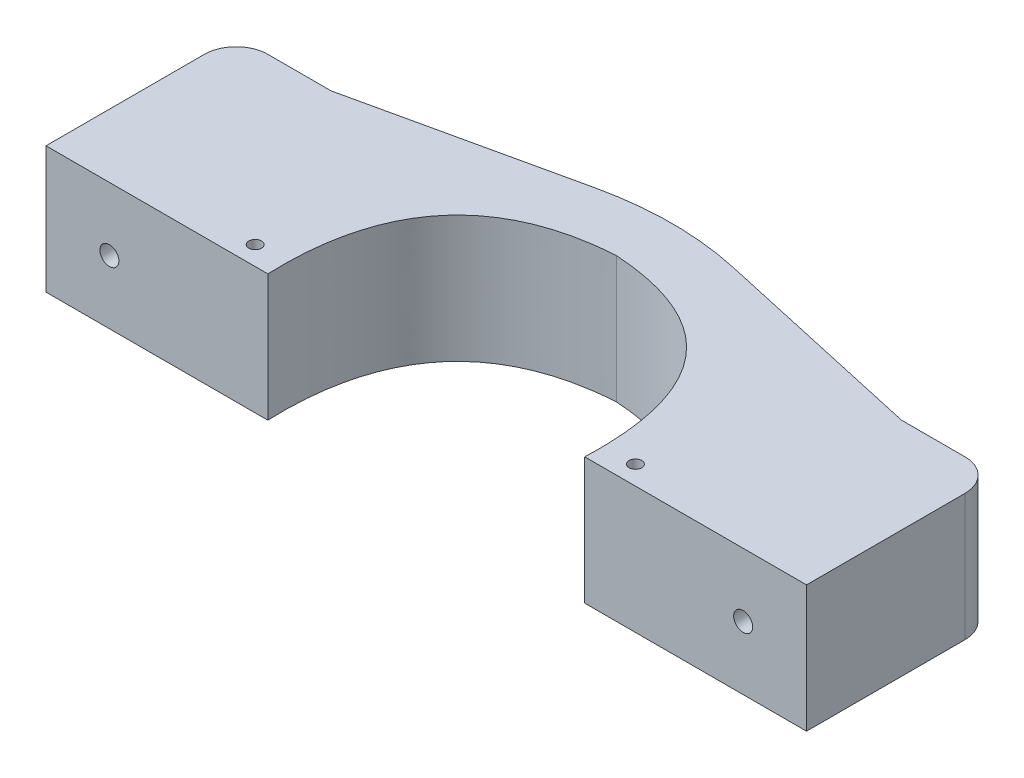
ISO-10303-21;
HEADER;
FILE_DESCRIPTION(('STEP AP214'),'2;1');
FILE_NAME('part.step','',(''),(''),'','','');
FILE_SCHEMA(('AUTOMOTIVE_DESIGN { 1 0 10303 214 1 1 1 1 }'));
ENDSEC;
DATA;
#1=APPLICATION_CONTEXT('core data for automotive mechanical design processes');
#2=APPLICATION_PROTOCOL_DEFINITION('international standard','automotive_design',2000,#1);
#3=PRODUCT_CONTEXT('',#1,'mechanical');
#4=PRODUCT('Part','Part','',(#3));
#5=PRODUCT_RELATED_PRODUCT_CATEGORY('part','',(#4));
#6=PRODUCT_DEFINITION_FORMATION('','',#4);
#7=PRODUCT_DEFINITION_CONTEXT('part definition',#1,'design');
#8=PRODUCT_DEFINITION('design','',#6,#7);
#9=PRODUCT_DEFINITION_SHAPE('','',#8);
#10=(LENGTH_UNIT() NAMED_UNIT(*) SI_UNIT(.MILLI.,.METRE.));
#11=(NAMED_UNIT(*) PLANE_ANGLE_UNIT() SI_UNIT($,.RADIAN.));
#12=(NAMED_UNIT(*) SI_UNIT($,.STERADIAN.) SOLID_ANGLE_UNIT());
#13=UNCERTAINTY_MEASURE_WITH_UNIT(LENGTH_MEASURE(1.E-05),#10,'distance_accuracy_value','');
#14=(GEOMETRIC_REPRESENTATION_CONTEXT(3) GLOBAL_UNCERTAINTY_ASSIGNED_CONTEXT((#13)) GLOBAL_UNIT_ASSIGNED_CONTEXT((#10,
#11,#12)) REPRESENTATION_CONTEXT('',''));
#15=CARTESIAN_POINT('',(0.,0.,0.));
#16=DIRECTION('',(0.,0.,1.));
#17=DIRECTION('',(1.,0.,0.));
#18=AXIS2_PLACEMENT_3D('',#15,#16,#17);
#19=CARTESIAN_POINT('',(-25.,20.,30.));
#20=CARTESIAN_POINT('',(-26.0775504998277,20.,1.65856280443021));
#21=CARTESIAN_POINT('',(0.,20.,0.));
#22=B_SPLINE_CURVE_WITH_KNOTS('',2,(#19,#20,#21),.UNSPECIFIED.,.F.,.F.,(3,3),(0.,1.),.UNSPECIFIED.);
#23=DIRECTION('',(0.,-1.,0.));
#24=VECTOR('',#23,1.);
#25=SURFACE_OF_LINEAR_EXTRUSION('',#22,#24);
#26=CARTESIAN_POINT('',(-25.,0.,30.));
#27=CARTESIAN_POINT('',(-26.0775504998277,0.,1.65856280443021));
#28=CARTESIAN_POINT('',(0.,0.,0.));
#29=B_SPLINE_CURVE_WITH_KNOTS('',2,(#26,#27,#28),.UNSPECIFIED.,.F.,.F.,(3,3),(0.,1.),.UNSPECIFIED.);
#30=CARTESIAN_POINT('',(-25.,0.,30.));
#31=VERTEX_POINT('',#30);
#32=CARTESIAN_POINT('',(0.,0.,0.));
#33=VERTEX_POINT('',#32);
#34=EDGE_CURVE('E150',#31,#33,#29,.T.);
#35=ORIENTED_EDGE('',*,*,#34,.T.);
#36=DIRECTION('',(0.,-1.,0.));
#37=VECTOR('',#36,1.);
#38=CARTESIAN_POINT('',(0.,20.,0.));
#39=LINE('',#38,#37);
#40=CARTESIAN_POINT('',(0.,20.,0.));
#41=VERTEX_POINT('',#40);
#42=EDGE_CURVE('E131',#41,#33,#39,.T.);
#43=ORIENTED_EDGE('',*,*,#42,.F.);
#44=CARTESIAN_POINT('',(-25.,20.,30.));
#45=VERTEX_POINT('',#44);
#46=EDGE_CURVE('E137',#45,#41,#22,.T.);
#47=ORIENTED_EDGE('',*,*,#46,.F.);
#48=DIRECTION('',(0.,-1.,0.));
#49=VECTOR('',#48,1.);
#50=CARTESIAN_POINT('',(-25.,20.,30.));
#51=LINE('',#50,#49);
#52=EDGE_CURVE('E198',#45,#31,#51,.T.);
#53=ORIENTED_EDGE('',*,*,#52,.T.);
#54=EDGE_LOOP('',(#35,#43,#47,#53));
#55=FACE_BOUND('',#54,.T.);
#56=ADVANCED_FACE('F32',(#55),#25,.F.);
#57=CARTESIAN_POINT('',(0.,20.,0.));
#58=CARTESIAN_POINT('',(26.0775504998278,20.,1.6585628044302));
#59=CARTESIAN_POINT('',(25.,20.,30.));
#60=B_SPLINE_CURVE_WITH_KNOTS('',2,(#57,#58,#59),.UNSPECIFIED.,.F.,.F.,(3,3),(0.,1.),.UNSPECIFIED.);
#61=DIRECTION('',(0.,-1.,0.));
#62=VECTOR('',#61,1.);
#63=SURFACE_OF_LINEAR_EXTRUSION('',#60,#62);
#64=CARTESIAN_POINT('',(0.,0.,0.));
#65=CARTESIAN_POINT('',(26.0775504998278,0.,1.6585628044302));
#66=CARTESIAN_POINT('',(25.,0.,30.));
#67=B_SPLINE_CURVE_WITH_KNOTS('',2,(#64,#65,#66),.UNSPECIFIED.,.F.,.F.,(3,3),(0.,1.),.UNSPECIFIED.);
#68=CARTESIAN_POINT('',(25.,0.,30.));
#69=VERTEX_POINT('',#68);
#70=EDGE_CURVE('E224',#33,#69,#67,.T.);
#71=ORIENTED_EDGE('',*,*,#70,.T.);
#72=DIRECTION('',(0.,-1.,0.));
#73=VECTOR('',#72,1.);
#74=CARTESIAN_POINT('',(25.,20.,30.));
#75=LINE('',#74,#73);
#76=CARTESIAN_POINT('',(25.,20.,30.));
#77=VERTEX_POINT('',#76);
#78=EDGE_CURVE('E134',#77,#69,#75,.T.);
#79=ORIENTED_EDGE('',*,*,#78,.F.);
#80=EDGE_CURVE('E127',#41,#77,#60,.T.);
#81=ORIENTED_EDGE('',*,*,#80,.F.);
#82=ORIENTED_EDGE('',*,*,#42,.T.);
#83=EDGE_LOOP('',(#71,#79,#81,#82));
#84=FACE_BOUND('',#83,.T.);
#85=ADVANCED_FACE('F129',(#84),#63,.F.);
#86=CARTESIAN_POINT('',(25.,20.,30.));
#87=DIRECTION('',(0.,0.,-1.));
#88=DIRECTION('',(-1.,0.,0.));
#89=AXIS2_PLACEMENT_3D('',#86,#87,#88);
#90=PLANE('',#89);
#91=CARTESIAN_POINT('',(50.,10.,30.));
#92=DIRECTION('',(0.,0.,1.));
#93=DIRECTION('',(1.,0.,0.));
#94=AXIS2_PLACEMENT_3D('',#91,#92,#93);
#95=CIRCLE('',#94,1.5);
#96=CARTESIAN_POINT('',(51.5,10.,30.));
#97=VERTEX_POINT('',#96);
#98=EDGE_CURVE('E247',#97,#97,#95,.T.);
#99=ORIENTED_EDGE('',*,*,#98,.F.);
#100=EDGE_LOOP('',(#99));
#101=FACE_BOUND('',#100,.T.);
#102=DIRECTION('',(1.,0.,0.));
#103=VECTOR('',#102,1.);
#104=CARTESIAN_POINT('',(25.,0.,30.));
#105=LINE('',#104,#103);
#106=CARTESIAN_POINT('',(60.,0.,30.));
#107=VERTEX_POINT('',#106);
#108=EDGE_CURVE('E219',#69,#107,#105,.T.);
#109=ORIENTED_EDGE('',*,*,#108,.T.);
#110=DIRECTION('',(0.,-1.,0.));
#111=VECTOR('',#110,1.);
#112=CARTESIAN_POINT('',(60.,20.,30.));
#113=LINE('',#112,#111);
#114=CARTESIAN_POINT('',(60.,20.,30.));
#115=VERTEX_POINT('',#114);
#116=EDGE_CURVE('E156',#115,#107,#113,.T.);
#117=ORIENTED_EDGE('',*,*,#116,.F.);
#118=DIRECTION('',(1.,0.,0.));
#119=VECTOR('',#118,1.);
#120=CARTESIAN_POINT('',(25.,20.,30.));
#121=LINE('',#120,#119);
#122=EDGE_CURVE('E136',#77,#115,#121,.T.);
#123=ORIENTED_EDGE('',*,*,#122,.F.);
#124=ORIENTED_EDGE('',*,*,#78,.T.);
#125=EDGE_LOOP('',(#109,#117,#123,#124));
#126=FACE_BOUND('',#125,.T.);
#127=ADVANCED_FACE('F256',(#101,#126),#90,.F.);
#128=CARTESIAN_POINT('',(60.,20.,30.));
#129=DIRECTION('',(-1.,0.,0.));
#130=DIRECTION('',(0.,0.,1.));
#131=AXIS2_PLACEMENT_3D('',#128,#129,#130);
#132=PLANE('',#131);
#133=DIRECTION('',(0.,0.,-1.));
#134=VECTOR('',#133,1.);
#135=CARTESIAN_POINT('',(60.,0.,30.));
#136=LINE('',#135,#134);
#137=CARTESIAN_POINT('',(60.,0.,4.99999999999999));
#138=VERTEX_POINT('',#137);
#139=EDGE_CURVE('E214',#107,#138,#136,.T.);
#140=ORIENTED_EDGE('',*,*,#139,.T.);
#141=DIRECTION('',(0.,-1.,0.));
#142=VECTOR('',#141,1.);
#143=CARTESIAN_POINT('',(60.,20.,4.99999999999999));
#144=LINE('',#143,#142);
#145=CARTESIAN_POINT('',(60.,20.,4.99999999999999));
#146=VERTEX_POINT('',#145);
#147=EDGE_CURVE('E172',#138,#146,#144,.F.);
#148=ORIENTED_EDGE('',*,*,#147,.T.);
#149=DIRECTION('',(0.,0.,-1.));
#150=VECTOR('',#149,1.);
#151=CARTESIAN_POINT('',(60.,20.,30.));
#152=LINE('',#151,#150);
#153=EDGE_CURVE('E216',#115,#146,#152,.T.);
#154=ORIENTED_EDGE('',*,*,#153,.F.);
#155=ORIENTED_EDGE('',*,*,#116,.T.);
#156=EDGE_LOOP('',(#140,#148,#154,#155));
#157=FACE_BOUND('',#156,.T.);
#158=ADVANCED_FACE('F213',(#157),#132,.F.);
#159=CARTESIAN_POINT('',(45.,20.,0.));
#160=DIRECTION('',(0.,0.,1.));
#161=DIRECTION('',(1.,0.,0.));
#162=AXIS2_PLACEMENT_3D('',#159,#160,#161);
#163=PLANE('',#162);
#164=CARTESIAN_POINT('',(50.,10.,0.));
#165=DIRECTION('',(0.,0.,-1.));
#166=DIRECTION('',(-1.,0.,0.));
#167=AXIS2_PLACEMENT_3D('',#164,#165,#166);
#168=CIRCLE('',#167,2.5);
#169=CARTESIAN_POINT('',(47.5,10.,0.));
#170=VERTEX_POINT('',#169);
#171=EDGE_CURVE('E308',#170,#170,#168,.T.);
#172=ORIENTED_EDGE('',*,*,#171,.F.);
#173=EDGE_LOOP('',(#172));
#174=FACE_BOUND('',#173,.T.);
#175=DIRECTION('',(-1.,0.,0.));
#176=VECTOR('',#175,1.);
#177=CARTESIAN_POINT('',(45.,20.,0.));
#178=LINE('',#177,#176);
#179=CARTESIAN_POINT('',(55.,20.,0.));
#180=VERTEX_POINT('',#179);
#181=CARTESIAN_POINT('',(45.,20.,0.));
#182=VERTEX_POINT('',#181);
#183=EDGE_CURVE('E258',#180,#182,#178,.T.);
#184=ORIENTED_EDGE('',*,*,#183,.F.);
#185=DIRECTION('',(0.,-1.,0.));
#186=VECTOR('',#185,1.);
#187=CARTESIAN_POINT('',(55.,20.,0.));
#188=LINE('',#187,#186);
#189=CARTESIAN_POINT('',(55.,0.,0.));
#190=VERTEX_POINT('',#189);
#191=EDGE_CURVE('E165',#180,#190,#188,.T.);
#192=ORIENTED_EDGE('',*,*,#191,.T.);
#193=DIRECTION('',(-1.,0.,0.));
#194=VECTOR('',#193,1.);
#195=CARTESIAN_POINT('',(45.,0.,0.));
#196=LINE('',#195,#194);
#197=CARTESIAN_POINT('',(45.,0.,0.));
#198=VERTEX_POINT('',#197);
#199=EDGE_CURVE('E220',#190,#198,#196,.T.);
#200=ORIENTED_EDGE('',*,*,#199,.T.);
#201=DIRECTION('',(0.,-1.,0.));
#202=VECTOR('',#201,1.);
#203=CARTESIAN_POINT('',(45.,20.,0.));
#204=LINE('',#203,#202);
#205=EDGE_CURVE('E205',#182,#198,#204,.T.);
#206=ORIENTED_EDGE('',*,*,#205,.F.);
#207=EDGE_LOOP('',(#184,#192,#200,#206));
#208=FACE_BOUND('',#207,.T.);
#209=ADVANCED_FACE('F276',(#174,#208),#163,.F.);
#210=CARTESIAN_POINT('',(0.,20.,-10.));
#211=DIRECTION('',(-0.216930457818656,0.,0.976187060183953));
#212=DIRECTION('',(0.976187060183953,0.,0.216930457818656));
#213=AXIS2_PLACEMENT_3D('',#210,#211,#212);
#214=PLANE('',#213);
#215=DIRECTION('',(-0.976187060183953,0.,-0.216930457818656));
#216=VECTOR('',#215,1.);
#217=CARTESIAN_POINT('',(0.,0.,-10.));
#218=LINE('',#217,#216);
#219=CARTESIAN_POINT('',(10.8465228909328,0.,-7.58966157979271));
#220=VERTEX_POINT('',#219);
#221=EDGE_CURVE('E222',#198,#220,#218,.T.);
#222=ORIENTED_EDGE('',*,*,#221,.T.);
#223=DIRECTION('',(0.,-1.,0.));
#224=VECTOR('',#223,1.);
#225=CARTESIAN_POINT('',(10.8465228909328,20.,-7.58966157979271));
#226=LINE('',#225,#224);
#227=CARTESIAN_POINT('',(10.8465228909328,20.,-7.58966157979271));
#228=VERTEX_POINT('',#227);
#229=EDGE_CURVE('E161',#220,#228,#226,.F.);
#230=ORIENTED_EDGE('',*,*,#229,.T.);
#231=DIRECTION('',(-0.976187060183953,0.,-0.216930457818656));
#232=VECTOR('',#231,1.);
#233=CARTESIAN_POINT('',(0.,20.,-10.));
#234=LINE('',#233,#232);
#235=EDGE_CURVE('E240',#182,#228,#234,.T.);
#236=ORIENTED_EDGE('',*,*,#235,.F.);
#237=ORIENTED_EDGE('',*,*,#205,.T.);
#238=EDGE_LOOP('',(#222,#230,#236,#237));
#239=FACE_BOUND('',#238,.T.);
#240=ADVANCED_FACE('F274',(#239),#214,.F.);
#241=CARTESIAN_POINT('',(0.,20.,-10.));
#242=DIRECTION('',(0.216930457818656,0.,0.976187060183953));
#243=DIRECTION('',(0.976187060183953,0.,-0.216930457818656));
#244=AXIS2_PLACEMENT_3D('',#241,#242,#243);
#245=PLANE('',#244);
#246=DIRECTION('',(-0.976187060183953,0.,0.216930457818656));
#247=VECTOR('',#246,1.);
#248=CARTESIAN_POINT('',(0.,20.,-10.));
#249=LINE('',#248,#247);
#250=CARTESIAN_POINT('',(-10.8465228909328,20.,-7.58966157979271));
#251=VERTEX_POINT('',#250);
#252=CARTESIAN_POINT('',(-45.,20.,0.));
#253=VERTEX_POINT('',#252);
#254=EDGE_CURVE('E237',#251,#253,#249,.T.);
#255=ORIENTED_EDGE('',*,*,#254,.F.);
#256=DIRECTION('',(0.,-1.,0.));
#257=VECTOR('',#256,1.);
#258=CARTESIAN_POINT('',(-10.8465228909328,20.,-7.58966157979271));
#259=LINE('',#258,#257);
#260=CARTESIAN_POINT('',(-10.8465228909328,0.,-7.58966157979271));
#261=VERTEX_POINT('',#260);
#262=EDGE_CURVE('E151',#251,#261,#259,.T.);
#263=ORIENTED_EDGE('',*,*,#262,.T.);
#264=DIRECTION('',(-0.976187060183953,0.,0.216930457818656));
#265=VECTOR('',#264,1.);
#266=CARTESIAN_POINT('',(0.,0.,-10.));
#267=LINE('',#266,#265);
#268=CARTESIAN_POINT('',(-45.,0.,0.));
#269=VERTEX_POINT('',#268);
#270=EDGE_CURVE('E194',#261,#269,#267,.T.);
#271=ORIENTED_EDGE('',*,*,#270,.T.);
#272=DIRECTION('',(0.,-1.,0.));
#273=VECTOR('',#272,1.);
#274=CARTESIAN_POINT('',(-45.,20.,0.));
#275=LINE('',#274,#273);
#276=EDGE_CURVE('E202',#253,#269,#275,.T.);
#277=ORIENTED_EDGE('',*,*,#276,.F.);
#278=EDGE_LOOP('',(#255,#263,#271,#277));
#279=FACE_BOUND('',#278,.T.);
#280=ADVANCED_FACE('F233',(#279),#245,.F.);
#281=CARTESIAN_POINT('',(-45.,20.,0.));
#282=DIRECTION('',(0.,0.,1.));
#283=DIRECTION('',(1.,0.,0.));
#284=AXIS2_PLACEMENT_3D('',#281,#282,#283);
#285=PLANE('',#284);
#286=CARTESIAN_POINT('',(-50.,10.,0.));
#287=DIRECTION('',(0.,0.,1.));
#288=DIRECTION('',(1.,0.,0.));
#289=AXIS2_PLACEMENT_3D('',#286,#287,#288);
#290=CIRCLE('',#289,2.5);
#291=CARTESIAN_POINT('',(-47.5,10.,0.));
#292=VERTEX_POINT('',#291);
#293=EDGE_CURVE('E320',#292,#292,#290,.T.);
#294=ORIENTED_EDGE('',*,*,#293,.T.);
#295=EDGE_LOOP('',(#294));
#296=FACE_BOUND('',#295,.T.);
#297=DIRECTION('',(-1.,0.,0.));
#298=VECTOR('',#297,1.);
#299=CARTESIAN_POINT('',(-45.,0.,0.));
#300=LINE('',#299,#298);
#301=CARTESIAN_POINT('',(-55.,0.,0.));
#302=VERTEX_POINT('',#301);
#303=EDGE_CURVE('E191',#269,#302,#300,.T.);
#304=ORIENTED_EDGE('',*,*,#303,.T.);
#305=DIRECTION('',(0.,-1.,0.));
#306=VECTOR('',#305,1.);
#307=CARTESIAN_POINT('',(-55.,20.,0.));
#308=LINE('',#307,#306);
#309=CARTESIAN_POINT('',(-55.,20.,0.));
#310=VERTEX_POINT('',#309);
#311=EDGE_CURVE('E11',#302,#310,#308,.F.);
#312=ORIENTED_EDGE('',*,*,#311,.T.);
#313=DIRECTION('',(-1.,0.,0.));
#314=VECTOR('',#313,1.);
#315=CARTESIAN_POINT('',(-45.,20.,0.));
#316=LINE('',#315,#314);
#317=EDGE_CURVE('E236',#253,#310,#316,.T.);
#318=ORIENTED_EDGE('',*,*,#317,.F.);
#319=ORIENTED_EDGE('',*,*,#276,.T.);
#320=EDGE_LOOP('',(#304,#312,#318,#319));
#321=FACE_BOUND('',#320,.T.);
#322=ADVANCED_FACE('F235',(#296,#321),#285,.F.);
#323=CARTESIAN_POINT('',(-60.,20.,30.));
#324=DIRECTION('',(1.,0.,0.));
#325=DIRECTION('',(0.,0.,-1.));
#326=AXIS2_PLACEMENT_3D('',#323,#324,#325);
#327=PLANE('',#326);
#328=DIRECTION('',(0.,0.,1.));
#329=VECTOR('',#328,1.);
#330=CARTESIAN_POINT('',(-60.,20.,30.));
#331=LINE('',#330,#329);
#332=CARTESIAN_POINT('',(-60.,20.,5.));
#333=VERTEX_POINT('',#332);
#334=CARTESIAN_POINT('',(-60.,20.,30.));
#335=VERTEX_POINT('',#334);
#336=EDGE_CURVE('E184',#333,#335,#331,.T.);
#337=ORIENTED_EDGE('',*,*,#336,.F.);
#338=DIRECTION('',(0.,-1.,0.));
#339=VECTOR('',#338,1.);
#340=CARTESIAN_POINT('',(-60.,20.,4.99999999999999));
#341=LINE('',#340,#339);
#342=CARTESIAN_POINT('',(-60.,0.,5.));
#343=VERTEX_POINT('',#342);
#344=EDGE_CURVE('E40',#333,#343,#341,.T.);
#345=ORIENTED_EDGE('',*,*,#344,.T.);
#346=DIRECTION('',(0.,0.,1.));
#347=VECTOR('',#346,1.);
#348=CARTESIAN_POINT('',(-60.,0.,30.));
#349=LINE('',#348,#347);
#350=CARTESIAN_POINT('',(-60.,0.,30.));
#351=VERTEX_POINT('',#350);
#352=EDGE_CURVE('E182',#343,#351,#349,.T.);
#353=ORIENTED_EDGE('',*,*,#352,.T.);
#354=DIRECTION('',(0.,-1.,0.));
#355=VECTOR('',#354,1.);
#356=CARTESIAN_POINT('',(-60.,20.,30.));
#357=LINE('',#356,#355);
#358=EDGE_CURVE('E200',#335,#351,#357,.T.);
#359=ORIENTED_EDGE('',*,*,#358,.F.);
#360=EDGE_LOOP('',(#337,#345,#353,#359));
#361=FACE_BOUND('',#360,.T.);
#362=ADVANCED_FACE('F180',(#361),#327,.F.);
#363=CARTESIAN_POINT('',(-25.,20.,30.));
#364=DIRECTION('',(0.,0.,-1.));
#365=DIRECTION('',(-1.,0.,0.));
#366=AXIS2_PLACEMENT_3D('',#363,#364,#365);
#367=PLANE('',#366);
#368=CARTESIAN_POINT('',(-50.,10.,30.));
#369=DIRECTION('',(0.,0.,-1.));
#370=DIRECTION('',(-1.,0.,0.));
#371=AXIS2_PLACEMENT_3D('',#368,#369,#370);
#372=CIRCLE('',#371,1.5);
#373=CARTESIAN_POINT('',(-51.5,10.,30.));
#374=VERTEX_POINT('',#373);
#375=EDGE_CURVE('E311',#374,#374,#372,.T.);
#376=ORIENTED_EDGE('',*,*,#375,.T.);
#377=EDGE_LOOP('',(#376));
#378=FACE_BOUND('',#377,.T.);
#379=DIRECTION('',(1.,0.,0.));
#380=VECTOR('',#379,1.);
#381=CARTESIAN_POINT('',(-25.,0.,30.));
#382=LINE('',#381,#380);
#383=EDGE_CURVE('E147',#351,#31,#382,.T.);
#384=ORIENTED_EDGE('',*,*,#383,.T.);
#385=ORIENTED_EDGE('',*,*,#52,.F.);
#386=DIRECTION('',(1.,0.,0.));
#387=VECTOR('',#386,1.);
#388=CARTESIAN_POINT('',(-25.,20.,30.));
#389=LINE('',#388,#387);
#390=EDGE_CURVE('E143',#335,#45,#389,.T.);
#391=ORIENTED_EDGE('',*,*,#390,.F.);
#392=ORIENTED_EDGE('',*,*,#358,.T.);
#393=EDGE_LOOP('',(#384,#385,#391,#392));
#394=FACE_BOUND('',#393,.T.);
#395=ADVANCED_FACE('F382',(#378,#394),#367,.F.);
#396=CARTESIAN_POINT('',(-19.2887752499139,20.,8.3292814022151));
#397=DIRECTION('',(0.,-1.,0.));
#398=DIRECTION('',(0.,0.,-1.));
#399=AXIS2_PLACEMENT_3D('',#396,#397,#398);
#400=PLANE('',#399);
#401=CARTESIAN_POINT('',(-30.,20.,27.));
#402=DIRECTION('',(0.,-1.,0.));
#403=DIRECTION('',(0.,0.,1.));
#404=AXIS2_PLACEMENT_3D('',#401,#402,#403);
#405=CIRCLE('',#404,1.);
#406=CARTESIAN_POINT('',(-30.,20.,28.));
#407=VERTEX_POINT('',#406);
#408=EDGE_CURVE('E334',#407,#407,#405,.T.);
#409=ORIENTED_EDGE('',*,*,#408,.T.);
#410=EDGE_LOOP('',(#409));
#411=FACE_BOUND('',#410,.T.);
#412=CARTESIAN_POINT('',(30.,20.,27.));
#413=DIRECTION('',(0.,1.,0.));
#414=DIRECTION('',(0.,0.,1.));
#415=AXIS2_PLACEMENT_3D('',#412,#413,#414);
#416=CIRCLE('',#415,1.);
#417=CARTESIAN_POINT('',(30.,20.,28.));
#418=VERTEX_POINT('',#417);
#419=EDGE_CURVE('E328',#418,#418,#416,.T.);
#420=ORIENTED_EDGE('',*,*,#419,.F.);
#421=EDGE_LOOP('',(#420));
#422=FACE_BOUND('',#421,.T.);
#423=ORIENTED_EDGE('',*,*,#153,.T.);
#424=CARTESIAN_POINT('',(55.,20.,5.));
#425=DIRECTION('',(0.,-1.,0.));
#426=DIRECTION('',(0.,0.,-1.));
#427=AXIS2_PLACEMENT_3D('',#424,#425,#426);
#428=CIRCLE('',#427,5.);
#429=EDGE_CURVE('E175',#146,#180,#428,.F.);
#430=ORIENTED_EDGE('',*,*,#429,.T.);
#431=ORIENTED_EDGE('',*,*,#183,.T.);
#432=ORIENTED_EDGE('',*,*,#235,.T.);
#433=CARTESIAN_POINT('',(0.,20.,41.2196914294049));
#434=DIRECTION('',(0.,-1.,0.));
#435=DIRECTION('',(0.,0.,-1.));
#436=AXIS2_PLACEMENT_3D('',#433,#434,#435);
#437=CIRCLE('',#436,50.);
#438=EDGE_CURVE('E163',#228,#251,#437,.F.);
#439=ORIENTED_EDGE('',*,*,#438,.T.);
#440=ORIENTED_EDGE('',*,*,#254,.T.);
#441=ORIENTED_EDGE('',*,*,#317,.T.);
#442=CARTESIAN_POINT('',(-55.,20.,4.99999999999999));
#443=DIRECTION('',(0.,-1.,0.));
#444=DIRECTION('',(0.,0.,-1.));
#445=AXIS2_PLACEMENT_3D('',#442,#443,#444);
#446=CIRCLE('',#445,5.);
#447=EDGE_CURVE('E47',#310,#333,#446,.F.);
#448=ORIENTED_EDGE('',*,*,#447,.T.);
#449=ORIENTED_EDGE('',*,*,#336,.T.);
#450=ORIENTED_EDGE('',*,*,#390,.T.);
#451=ORIENTED_EDGE('',*,*,#46,.T.);
#452=ORIENTED_EDGE('',*,*,#80,.T.);
#453=ORIENTED_EDGE('',*,*,#122,.T.);
#454=EDGE_LOOP('',(#423,#430,#431,#432,#439,#440,#441,#448,#449,#450,#451,#452,#453));
#455=FACE_BOUND('',#454,.T.);
#456=ADVANCED_FACE('F141',(#411,#422,#455),#400,.F.);
#457=CARTESIAN_POINT('',(-19.2887752499139,0.,8.3292814022151));
#458=DIRECTION('',(0.,-1.,0.));
#459=DIRECTION('',(0.,0.,-1.));
#460=AXIS2_PLACEMENT_3D('',#457,#458,#459);
#461=PLANE('',#460);
#462=CARTESIAN_POINT('',(-30.,0.,27.));
#463=DIRECTION('',(0.,-1.,0.));
#464=DIRECTION('',(0.,0.,-1.));
#465=AXIS2_PLACEMENT_3D('',#462,#463,#464);
#466=CIRCLE('',#465,1.);
#467=CARTESIAN_POINT('',(-30.,0.,26.));
#468=VERTEX_POINT('',#467);
#469=EDGE_CURVE('E331',#468,#468,#466,.T.);
#470=ORIENTED_EDGE('',*,*,#469,.F.);
#471=EDGE_LOOP('',(#470));
#472=FACE_BOUND('',#471,.T.);
#473=CARTESIAN_POINT('',(30.,0.,27.));
#474=DIRECTION('',(0.,-1.,0.));
#475=DIRECTION('',(0.,0.,-1.));
#476=AXIS2_PLACEMENT_3D('',#473,#474,#475);
#477=CIRCLE('',#476,1.);
#478=CARTESIAN_POINT('',(30.,0.,26.));
#479=VERTEX_POINT('',#478);
#480=EDGE_CURVE('E323',#479,#479,#477,.F.);
#481=ORIENTED_EDGE('',*,*,#480,.T.);
#482=EDGE_LOOP('',(#481));
#483=FACE_BOUND('',#482,.T.);
#484=ORIENTED_EDGE('',*,*,#199,.F.);
#485=CARTESIAN_POINT('',(55.,0.,5.));
#486=DIRECTION('',(0.,-1.,0.));
#487=DIRECTION('',(0.,0.,-1.));
#488=AXIS2_PLACEMENT_3D('',#485,#486,#487);
#489=CIRCLE('',#488,5.);
#490=EDGE_CURVE('E170',#190,#138,#489,.T.);
#491=ORIENTED_EDGE('',*,*,#490,.T.);
#492=ORIENTED_EDGE('',*,*,#139,.F.);
#493=ORIENTED_EDGE('',*,*,#108,.F.);
#494=ORIENTED_EDGE('',*,*,#70,.F.);
#495=ORIENTED_EDGE('',*,*,#34,.F.);
#496=ORIENTED_EDGE('',*,*,#383,.F.);
#497=ORIENTED_EDGE('',*,*,#352,.F.);
#498=CARTESIAN_POINT('',(-55.,0.,4.99999999999999));
#499=DIRECTION('',(0.,-1.,0.));
#500=DIRECTION('',(0.,0.,-1.));
#501=AXIS2_PLACEMENT_3D('',#498,#499,#500);
#502=CIRCLE('',#501,5.);
#503=EDGE_CURVE('E168',#343,#302,#502,.T.);
#504=ORIENTED_EDGE('',*,*,#503,.T.);
#505=ORIENTED_EDGE('',*,*,#303,.F.);
#506=ORIENTED_EDGE('',*,*,#270,.F.);
#507=CARTESIAN_POINT('',(0.,0.,41.2196914294049));
#508=DIRECTION('',(0.,-1.,0.));
#509=DIRECTION('',(0.,0.,-1.));
#510=AXIS2_PLACEMENT_3D('',#507,#508,#509);
#511=CIRCLE('',#510,50.);
#512=EDGE_CURVE('E154',#261,#220,#511,.T.);
#513=ORIENTED_EDGE('',*,*,#512,.T.);
#514=ORIENTED_EDGE('',*,*,#221,.F.);
#515=EDGE_LOOP('',(#484,#491,#492,#493,#494,#495,#496,#497,#504,#505,#506,#513,#514));
#516=FACE_BOUND('',#515,.T.);
#517=ADVANCED_FACE('F189',(#472,#483,#516),#461,.T.);
#518=CARTESIAN_POINT('',(0.,20.,41.2196914294049));
#519=DIRECTION('',(0.,-1.,0.));
#520=DIRECTION('',(0.,0.,-1.));
#521=AXIS2_PLACEMENT_3D('',#518,#519,#520);
#522=CYLINDRICAL_SURFACE('',#521,50.);
#523=ORIENTED_EDGE('',*,*,#438,.F.);
#524=ORIENTED_EDGE('',*,*,#229,.F.);
#525=ORIENTED_EDGE('',*,*,#512,.F.);
#526=ORIENTED_EDGE('',*,*,#262,.F.);
#527=EDGE_LOOP('',(#523,#524,#525,#526));
#528=FACE_BOUND('',#527,.T.);
#529=ADVANCED_FACE('F272',(#528),#522,.T.);
#530=CARTESIAN_POINT('',(55.,20.,5.));
#531=DIRECTION('',(0.,-1.,0.));
#532=DIRECTION('',(0.,0.,-1.));
#533=AXIS2_PLACEMENT_3D('',#530,#531,#532);
#534=CYLINDRICAL_SURFACE('',#533,5.);
#535=ORIENTED_EDGE('',*,*,#429,.F.);
#536=ORIENTED_EDGE('',*,*,#147,.F.);
#537=ORIENTED_EDGE('',*,*,#490,.F.);
#538=ORIENTED_EDGE('',*,*,#191,.F.);
#539=EDGE_LOOP('',(#535,#536,#537,#538));
#540=FACE_BOUND('',#539,.T.);
#541=ADVANCED_FACE('F280',(#540),#534,.T.);
#542=CARTESIAN_POINT('',(-55.,20.,4.99999999999999));
#543=DIRECTION('',(0.,-1.,0.));
#544=DIRECTION('',(0.,0.,-1.));
#545=AXIS2_PLACEMENT_3D('',#542,#543,#544);
#546=CYLINDRICAL_SURFACE('',#545,5.);
#547=ORIENTED_EDGE('',*,*,#447,.F.);
#548=ORIENTED_EDGE('',*,*,#311,.F.);
#549=ORIENTED_EDGE('',*,*,#503,.F.);
#550=ORIENTED_EDGE('',*,*,#344,.F.);
#551=EDGE_LOOP('',(#547,#548,#549,#550));
#552=FACE_BOUND('',#551,.T.);
#553=ADVANCED_FACE('F34',(#552),#546,.T.);
#554=CARTESIAN_POINT('',(50.,10.,10.));
#555=DIRECTION('',(0.,0.,1.));
#556=DIRECTION('',(1.,0.,0.));
#557=AXIS2_PLACEMENT_3D('',#554,#555,#556);
#558=CYLINDRICAL_SURFACE('',#557,1.5);
#559=CARTESIAN_POINT('',(50.,10.,10.));
#560=DIRECTION('',(0.,0.,-1.));
#561=DIRECTION('',(-1.,0.,0.));
#562=AXIS2_PLACEMENT_3D('',#559,#560,#561);
#563=CIRCLE('',#562,1.5);
#564=CARTESIAN_POINT('',(48.5,10.,10.));
#565=VERTEX_POINT('',#564);
#566=EDGE_CURVE('E304',#565,#565,#563,.F.);
#567=ORIENTED_EDGE('',*,*,#566,.F.);
#568=EDGE_LOOP('',(#567));
#569=FACE_BOUND('',#568,.T.);
#570=ORIENTED_EDGE('',*,*,#98,.T.);
#571=EDGE_LOOP('',(#570));
#572=FACE_BOUND('',#571,.T.);
#573=ADVANCED_FACE('F286',(#569,#572),#558,.F.);
#574=CARTESIAN_POINT('',(50.,10.,10.));
#575=DIRECTION('',(0.,0.,-1.));
#576=DIRECTION('',(-1.,0.,0.));
#577=AXIS2_PLACEMENT_3D('',#574,#575,#576);
#578=PLANE('',#577);
#579=CARTESIAN_POINT('',(50.,10.,10.));
#580=DIRECTION('',(0.,0.,-1.));
#581=DIRECTION('',(-1.,0.,0.));
#582=AXIS2_PLACEMENT_3D('',#579,#580,#581);
#583=CIRCLE('',#582,2.5);
#584=CARTESIAN_POINT('',(47.5,10.,10.));
#585=VERTEX_POINT('',#584);
#586=EDGE_CURVE('E307',#585,#585,#583,.T.);
#587=ORIENTED_EDGE('',*,*,#586,.T.);
#588=EDGE_LOOP('',(#587));
#589=FACE_BOUND('',#588,.T.);
#590=ORIENTED_EDGE('',*,*,#566,.T.);
#591=EDGE_LOOP('',(#590));
#592=FACE_BOUND('',#591,.T.);
#593=ADVANCED_FACE('F371',(#589,#592),#578,.T.);
#594=CARTESIAN_POINT('',(50.,10.,10.));
#595=DIRECTION('',(0.,0.,-1.));
#596=DIRECTION('',(-1.,0.,0.));
#597=AXIS2_PLACEMENT_3D('',#594,#595,#596);
#598=CYLINDRICAL_SURFACE('',#597,2.5);
#599=ORIENTED_EDGE('',*,*,#586,.F.);
#600=EDGE_LOOP('',(#599));
#601=FACE_BOUND('',#600,.T.);
#602=ORIENTED_EDGE('',*,*,#171,.T.);
#603=EDGE_LOOP('',(#602));
#604=FACE_BOUND('',#603,.T.);
#605=ADVANCED_FACE('F369',(#601,#604),#598,.F.);
#606=CARTESIAN_POINT('',(-50.,10.,10.));
#607=DIRECTION('',(0.,0.,1.));
#608=DIRECTION('',(1.,0.,0.));
#609=AXIS2_PLACEMENT_3D('',#606,#607,#608);
#610=CYLINDRICAL_SURFACE('',#609,1.5);
#611=CARTESIAN_POINT('',(-50.,10.,10.));
#612=DIRECTION('',(0.,0.,-1.));
#613=DIRECTION('',(-1.,0.,0.));
#614=AXIS2_PLACEMENT_3D('',#611,#612,#613);
#615=CIRCLE('',#614,1.5);
#616=CARTESIAN_POINT('',(-51.5,10.,10.));
#617=VERTEX_POINT('',#616);
#618=EDGE_CURVE('E316',#617,#617,#615,.T.);
#619=ORIENTED_EDGE('',*,*,#618,.T.);
#620=EDGE_LOOP('',(#619));
#621=FACE_BOUND('',#620,.T.);
#622=ORIENTED_EDGE('',*,*,#375,.F.);
#623=EDGE_LOOP('',(#622));
#624=FACE_BOUND('',#623,.T.);
#625=ADVANCED_FACE('F365',(#621,#624),#610,.F.);
#626=CARTESIAN_POINT('',(-50.,10.,10.));
#627=DIRECTION('',(0.,0.,-1.));
#628=DIRECTION('',(-1.,0.,0.));
#629=AXIS2_PLACEMENT_3D('',#626,#627,#628);
#630=CYLINDRICAL_SURFACE('',#629,2.5);
#631=CARTESIAN_POINT('',(-50.,10.,10.));
#632=DIRECTION('',(0.,0.,1.));
#633=DIRECTION('',(1.,0.,0.));
#634=AXIS2_PLACEMENT_3D('',#631,#632,#633);
#635=CIRCLE('',#634,2.5);
#636=CARTESIAN_POINT('',(-47.5,10.,10.));
#637=VERTEX_POINT('',#636);
#638=EDGE_CURVE('E319',#637,#637,#635,.T.);
#639=ORIENTED_EDGE('',*,*,#638,.T.);
#640=EDGE_LOOP('',(#639));
#641=FACE_BOUND('',#640,.T.);
#642=ORIENTED_EDGE('',*,*,#293,.F.);
#643=EDGE_LOOP('',(#642));
#644=FACE_BOUND('',#643,.T.);
#645=ADVANCED_FACE('F359',(#641,#644),#630,.F.);
#646=CARTESIAN_POINT('',(-50.,10.,10.));
#647=DIRECTION('',(0.,0.,-1.));
#648=DIRECTION('',(1.,0.,0.));
#649=AXIS2_PLACEMENT_3D('',#646,#647,#648);
#650=PLANE('',#649);
#651=ORIENTED_EDGE('',*,*,#618,.F.);
#652=EDGE_LOOP('',(#651));
#653=FACE_BOUND('',#652,.T.);
#654=ORIENTED_EDGE('',*,*,#638,.F.);
#655=EDGE_LOOP('',(#654));
#656=FACE_BOUND('',#655,.T.);
#657=ADVANCED_FACE('F353',(#653,#656),#650,.T.);
#658=CARTESIAN_POINT('',(30.,-2.82842712474619,27.));
#659=DIRECTION('',(0.,1.,0.));
#660=DIRECTION('',(0.,0.,1.));
#661=AXIS2_PLACEMENT_3D('',#658,#659,#660);
#662=CYLINDRICAL_SURFACE('',#661,1.);
#663=ORIENTED_EDGE('',*,*,#419,.T.);
#664=EDGE_LOOP('',(#663));
#665=FACE_BOUND('',#664,.T.);
#666=ORIENTED_EDGE('',*,*,#480,.F.);
#667=EDGE_LOOP('',(#666));
#668=FACE_BOUND('',#667,.T.);
#669=ADVANCED_FACE('F343',(#665,#668),#662,.F.);
#670=CARTESIAN_POINT('',(-30.,-2.82842712474619,27.));
#671=DIRECTION('',(0.,1.,0.));
#672=DIRECTION('',(0.,0.,1.));
#673=AXIS2_PLACEMENT_3D('',#670,#671,#672);
#674=CYLINDRICAL_SURFACE('',#673,1.);
#675=ORIENTED_EDGE('',*,*,#408,.F.);
#676=EDGE_LOOP('',(#675));
#677=FACE_BOUND('',#676,.T.);
#678=ORIENTED_EDGE('',*,*,#469,.T.);
#679=EDGE_LOOP('',(#678));
#680=FACE_BOUND('',#679,.T.);
#681=ADVANCED_FACE('F340',(#677,#680),#674,.F.);
#682=CLOSED_SHELL('',(#56,#85,#127,#158,#209,#240,#280,#322,#362,#395,#456,#517,#529,#541,#553,
#573,#593,#605,#625,#645,#657,#669,#681));
#683=MANIFOLD_SOLID_BREP('B2',#682);
#684=ADVANCED_BREP_SHAPE_REPRESENTATION('',(#18,#683),#14);
#685=SHAPE_DEFINITION_REPRESENTATION(#9,#684);
ENDSEC;
END-ISO-10303-21;
